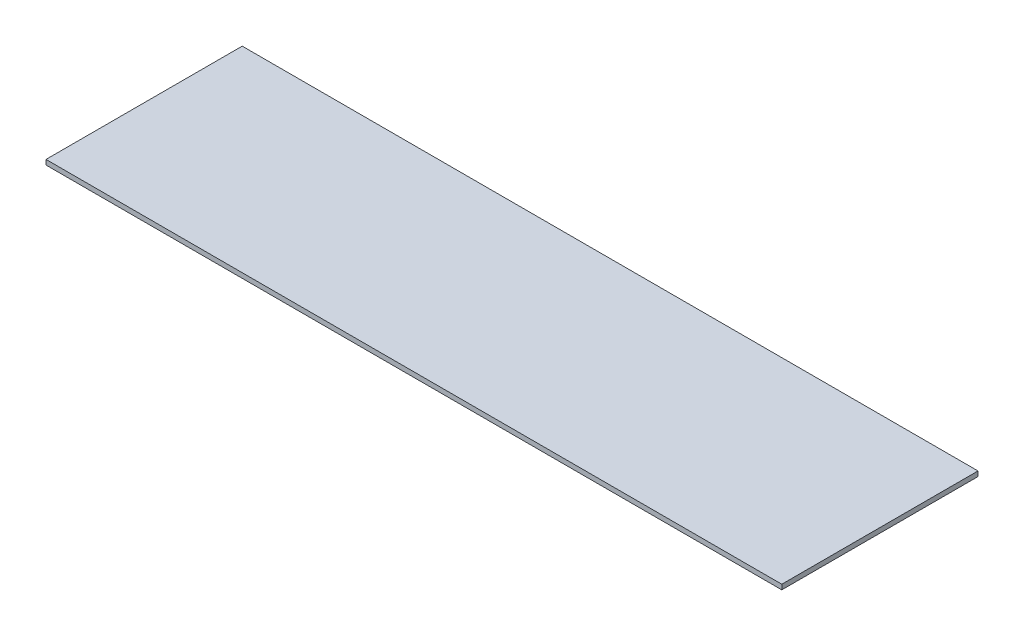
ISO-10303-21;
HEADER;
FILE_DESCRIPTION(('STEP AP214'),'2;1');
FILE_NAME('part.step','',(''),(''),'','','');
FILE_SCHEMA(('AUTOMOTIVE_DESIGN { 1 0 10303 214 1 1 1 1 }'));
ENDSEC;
DATA;
#1=APPLICATION_CONTEXT('core data for automotive mechanical design processes');
#2=APPLICATION_PROTOCOL_DEFINITION('international standard','automotive_design',2000,#1);
#3=PRODUCT_CONTEXT('',#1,'mechanical');
#4=PRODUCT('Part','Part','',(#3));
#5=PRODUCT_RELATED_PRODUCT_CATEGORY('part','',(#4));
#6=PRODUCT_DEFINITION_FORMATION('','',#4);
#7=PRODUCT_DEFINITION_CONTEXT('part definition',#1,'design');
#8=PRODUCT_DEFINITION('design','',#6,#7);
#9=PRODUCT_DEFINITION_SHAPE('','',#8);
#10=(LENGTH_UNIT() NAMED_UNIT(*) SI_UNIT(.MILLI.,.METRE.));
#11=(NAMED_UNIT(*) PLANE_ANGLE_UNIT() SI_UNIT($,.RADIAN.));
#12=(NAMED_UNIT(*) SI_UNIT($,.STERADIAN.) SOLID_ANGLE_UNIT());
#13=UNCERTAINTY_MEASURE_WITH_UNIT(LENGTH_MEASURE(1.E-05),#10,'distance_accuracy_value','');
#14=(GEOMETRIC_REPRESENTATION_CONTEXT(3) GLOBAL_UNCERTAINTY_ASSIGNED_CONTEXT((#13)) GLOBAL_UNIT_ASSIGNED_CONTEXT((#10,
#11,#12)) REPRESENTATION_CONTEXT('',''));
#15=CARTESIAN_POINT('',(0.,0.,0.));
#16=DIRECTION('',(0.,0.,1.));
#17=DIRECTION('',(1.,0.,0.));
#18=AXIS2_PLACEMENT_3D('',#15,#16,#17);
#19=CARTESIAN_POINT('',(-0.75,0.95,-1.));
#20=DIRECTION('',(1.,0.,0.));
#21=DIRECTION('',(0.,0.,-1.));
#22=AXIS2_PLACEMENT_3D('',#19,#20,#21);
#23=PLANE('',#22);
#24=DIRECTION('',(0.,1.,0.));
#25=VECTOR('',#24,1.);
#26=CARTESIAN_POINT('',(-0.75,0.955,-0.6));
#27=LINE('',#26,#25);
#28=CARTESIAN_POINT('',(-0.75,0.95,-0.6));
#29=VERTEX_POINT('',#28);
#30=CARTESIAN_POINT('',(-0.75,0.96,-0.6));
#31=VERTEX_POINT('',#30);
#32=EDGE_CURVE('E10',#29,#31,#27,.T.);
#33=ORIENTED_EDGE('',*,*,#32,.T.);
#34=DIRECTION('',(0.,0.,1.));
#35=VECTOR('',#34,1.);
#36=CARTESIAN_POINT('',(-0.75,0.96,-0.8));
#37=LINE('',#36,#35);
#38=CARTESIAN_POINT('',(-0.75,0.96,-1.));
#39=VERTEX_POINT('',#38);
#40=EDGE_CURVE('E35',#39,#31,#37,.T.);
#41=ORIENTED_EDGE('',*,*,#40,.F.);
#42=DIRECTION('',(0.,-1.,0.));
#43=VECTOR('',#42,1.);
#44=CARTESIAN_POINT('',(-0.75,0.955,-1.));
#45=LINE('',#44,#43);
#46=CARTESIAN_POINT('',(-0.75,0.95,-1.));
#47=VERTEX_POINT('',#46);
#48=EDGE_CURVE('E26',#39,#47,#45,.T.);
#49=ORIENTED_EDGE('',*,*,#48,.T.);
#50=DIRECTION('',(0.,0.,-1.));
#51=VECTOR('',#50,1.);
#52=CARTESIAN_POINT('',(-0.75,0.95,-0.8));
#53=LINE('',#52,#51);
#54=EDGE_CURVE('E78',#29,#47,#53,.T.);
#55=ORIENTED_EDGE('',*,*,#54,.F.);
#56=EDGE_LOOP('',(#33,#41,#49,#55));
#57=FACE_BOUND('',#56,.T.);
#58=ADVANCED_FACE('F16',(#57),#23,.F.);
#59=CARTESIAN_POINT('',(0.75,0.95,-1.));
#60=DIRECTION('',(0.,1.,0.));
#61=DIRECTION('',(0.,0.,1.));
#62=AXIS2_PLACEMENT_3D('',#59,#60,#61);
#63=PLANE('',#62);
#64=DIRECTION('',(-1.,0.,0.));
#65=VECTOR('',#64,1.);
#66=CARTESIAN_POINT('',(0.,0.95,-1.));
#67=LINE('',#66,#65);
#68=CARTESIAN_POINT('',(0.75,0.95,-1.));
#69=VERTEX_POINT('',#68);
#70=EDGE_CURVE('E80',#69,#47,#67,.T.);
#71=ORIENTED_EDGE('',*,*,#70,.F.);
#72=DIRECTION('',(0.,0.,-1.));
#73=VECTOR('',#72,1.);
#74=CARTESIAN_POINT('',(0.75,0.95,-0.8));
#75=LINE('',#74,#73);
#76=CARTESIAN_POINT('',(0.75,0.95,-0.6));
#77=VERTEX_POINT('',#76);
#78=EDGE_CURVE('E72',#77,#69,#75,.T.);
#79=ORIENTED_EDGE('',*,*,#78,.F.);
#80=DIRECTION('',(1.,0.,0.));
#81=VECTOR('',#80,1.);
#82=CARTESIAN_POINT('',(0.,0.95,-0.6));
#83=LINE('',#82,#81);
#84=EDGE_CURVE('E64',#29,#77,#83,.T.);
#85=ORIENTED_EDGE('',*,*,#84,.F.);
#86=ORIENTED_EDGE('',*,*,#54,.T.);
#87=EDGE_LOOP('',(#71,#79,#85,#86));
#88=FACE_BOUND('',#87,.T.);
#89=ADVANCED_FACE('F87',(#88),#63,.F.);
#90=CARTESIAN_POINT('',(-0.75,0.95,-1.));
#91=DIRECTION('',(0.,0.,1.));
#92=DIRECTION('',(1.,0.,0.));
#93=AXIS2_PLACEMENT_3D('',#90,#91,#92);
#94=PLANE('',#93);
#95=ORIENTED_EDGE('',*,*,#48,.F.);
#96=DIRECTION('',(-1.,0.,0.));
#97=VECTOR('',#96,1.);
#98=CARTESIAN_POINT('',(0.,0.96,-1.));
#99=LINE('',#98,#97);
#100=CARTESIAN_POINT('',(0.75,0.96,-1.));
#101=VERTEX_POINT('',#100);
#102=EDGE_CURVE('E53',#101,#39,#99,.T.);
#103=ORIENTED_EDGE('',*,*,#102,.F.);
#104=DIRECTION('',(0.,1.,0.));
#105=VECTOR('',#104,1.);
#106=CARTESIAN_POINT('',(0.75,0.955,-1.));
#107=LINE('',#106,#105);
#108=EDGE_CURVE('E63',#69,#101,#107,.T.);
#109=ORIENTED_EDGE('',*,*,#108,.F.);
#110=ORIENTED_EDGE('',*,*,#70,.T.);
#111=EDGE_LOOP('',(#95,#103,#109,#110));
#112=FACE_BOUND('',#111,.T.);
#113=ADVANCED_FACE('F89',(#112),#94,.F.);
#114=CARTESIAN_POINT('',(0.75,0.96,-1.));
#115=DIRECTION('',(-1.,0.,0.));
#116=DIRECTION('',(0.,0.,1.));
#117=AXIS2_PLACEMENT_3D('',#114,#115,#116);
#118=PLANE('',#117);
#119=ORIENTED_EDGE('',*,*,#108,.T.);
#120=DIRECTION('',(0.,0.,-1.));
#121=VECTOR('',#120,1.);
#122=CARTESIAN_POINT('',(0.75,0.96,-0.8));
#123=LINE('',#122,#121);
#124=CARTESIAN_POINT('',(0.75,0.96,-0.6));
#125=VERTEX_POINT('',#124);
#126=EDGE_CURVE('E59',#125,#101,#123,.T.);
#127=ORIENTED_EDGE('',*,*,#126,.F.);
#128=DIRECTION('',(0.,1.,0.));
#129=VECTOR('',#128,1.);
#130=CARTESIAN_POINT('',(0.75,0.955,-0.6));
#131=LINE('',#130,#129);
#132=EDGE_CURVE('E62',#77,#125,#131,.T.);
#133=ORIENTED_EDGE('',*,*,#132,.F.);
#134=ORIENTED_EDGE('',*,*,#78,.T.);
#135=EDGE_LOOP('',(#119,#127,#133,#134));
#136=FACE_BOUND('',#135,.T.);
#137=ADVANCED_FACE('F61',(#136),#118,.F.);
#138=CARTESIAN_POINT('',(0.75,0.95,-0.6));
#139=DIRECTION('',(0.,0.,-1.));
#140=DIRECTION('',(-1.,0.,0.));
#141=AXIS2_PLACEMENT_3D('',#138,#139,#140);
#142=PLANE('',#141);
#143=ORIENTED_EDGE('',*,*,#132,.T.);
#144=DIRECTION('',(1.,0.,0.));
#145=VECTOR('',#144,1.);
#146=CARTESIAN_POINT('',(0.,0.96,-0.6));
#147=LINE('',#146,#145);
#148=EDGE_CURVE('E20',#31,#125,#147,.T.);
#149=ORIENTED_EDGE('',*,*,#148,.F.);
#150=ORIENTED_EDGE('',*,*,#32,.F.);
#151=ORIENTED_EDGE('',*,*,#84,.T.);
#152=EDGE_LOOP('',(#143,#149,#150,#151));
#153=FACE_BOUND('',#152,.T.);
#154=ADVANCED_FACE('F68',(#153),#142,.F.);
#155=CARTESIAN_POINT('',(0.75,0.96,-1.));
#156=DIRECTION('',(0.,1.,0.));
#157=DIRECTION('',(0.,0.,1.));
#158=AXIS2_PLACEMENT_3D('',#155,#156,#157);
#159=PLANE('',#158);
#160=ORIENTED_EDGE('',*,*,#126,.T.);
#161=ORIENTED_EDGE('',*,*,#102,.T.);
#162=ORIENTED_EDGE('',*,*,#40,.T.);
#163=ORIENTED_EDGE('',*,*,#148,.T.);
#164=EDGE_LOOP('',(#160,#161,#162,#163));
#165=FACE_BOUND('',#164,.T.);
#166=ADVANCED_FACE('F18',(#165),#159,.T.);
#167=CLOSED_SHELL('',(#58,#89,#113,#137,#154,#166));
#168=MANIFOLD_SOLID_BREP('B1',#167);
#169=ADVANCED_BREP_SHAPE_REPRESENTATION('',(#18,#168),#14);
#170=SHAPE_DEFINITION_REPRESENTATION(#9,#169);
ENDSEC;
END-ISO-10303-21;
